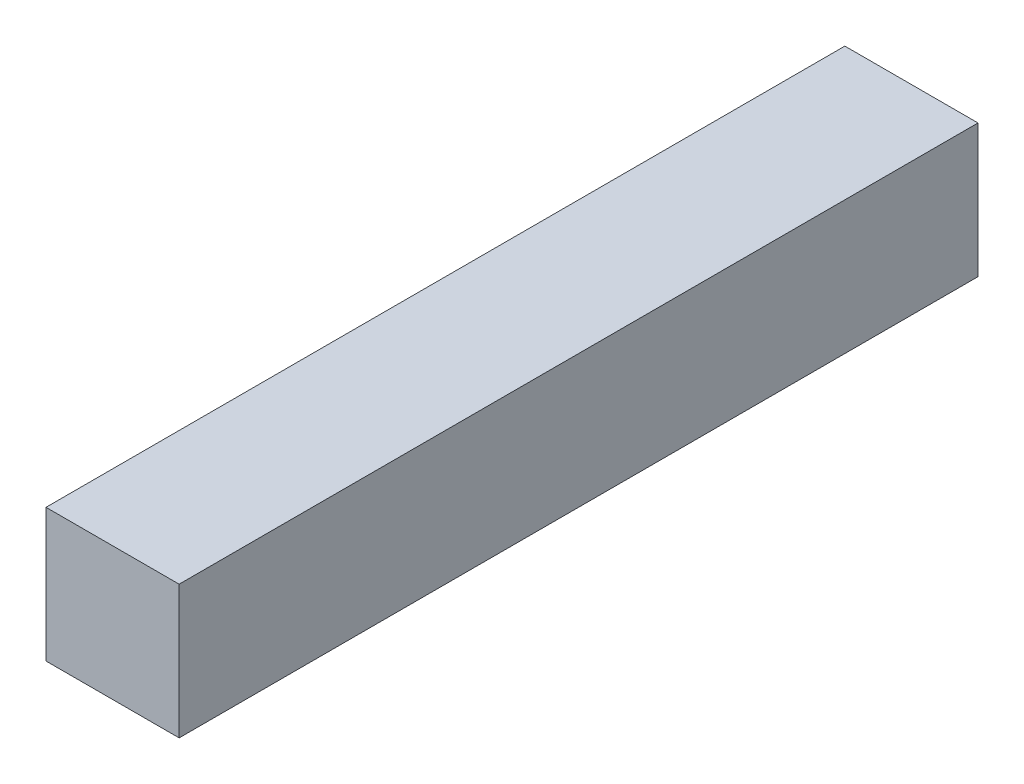
ISO-10303-21;
HEADER;
FILE_DESCRIPTION(('STEP AP214'),'2;1');
FILE_NAME('part.step','',(''),(''),'','','');
FILE_SCHEMA(('AUTOMOTIVE_DESIGN { 1 0 10303 214 1 1 1 1 }'));
ENDSEC;
DATA;
#1=APPLICATION_CONTEXT('core data for automotive mechanical design processes');
#2=APPLICATION_PROTOCOL_DEFINITION('international standard','automotive_design',2000,#1);
#3=PRODUCT_CONTEXT('',#1,'mechanical');
#4=PRODUCT('Part','Part','',(#3));
#5=PRODUCT_RELATED_PRODUCT_CATEGORY('part','',(#4));
#6=PRODUCT_DEFINITION_FORMATION('','',#4);
#7=PRODUCT_DEFINITION_CONTEXT('part definition',#1,'design');
#8=PRODUCT_DEFINITION('design','',#6,#7);
#9=PRODUCT_DEFINITION_SHAPE('','',#8);
#10=(LENGTH_UNIT() NAMED_UNIT(*) SI_UNIT(.MILLI.,.METRE.));
#11=(NAMED_UNIT(*) PLANE_ANGLE_UNIT() SI_UNIT($,.RADIAN.));
#12=(NAMED_UNIT(*) SI_UNIT($,.STERADIAN.) SOLID_ANGLE_UNIT());
#13=UNCERTAINTY_MEASURE_WITH_UNIT(LENGTH_MEASURE(1.E-05),#10,'distance_accuracy_value','');
#14=(GEOMETRIC_REPRESENTATION_CONTEXT(3) GLOBAL_UNCERTAINTY_ASSIGNED_CONTEXT((#13)) GLOBAL_UNIT_ASSIGNED_CONTEXT((#10,
#11,#12)) REPRESENTATION_CONTEXT('',''));
#15=CARTESIAN_POINT('',(0.,0.,0.));
#16=DIRECTION('',(0.,0.,1.));
#17=DIRECTION('',(1.,0.,0.));
#18=AXIS2_PLACEMENT_3D('',#15,#16,#17);
#19=CARTESIAN_POINT('',(0.,0.,0.));
#20=DIRECTION('',(0.,0.,-1.));
#21=DIRECTION('',(-1.,0.,0.));
#22=AXIS2_PLACEMENT_3D('',#19,#20,#21);
#23=PLANE('',#22);
#24=DIRECTION('',(0.,1.,0.));
#25=VECTOR('',#24,1.);
#26=CARTESIAN_POINT('',(5.,-5.,0.));
#27=LINE('',#26,#25);
#28=CARTESIAN_POINT('',(5.,-5.,0.));
#29=VERTEX_POINT('',#28);
#30=CARTESIAN_POINT('',(5.,5.,0.));
#31=VERTEX_POINT('',#30);
#32=EDGE_CURVE('E127',#29,#31,#27,.T.);
#33=ORIENTED_EDGE('',*,*,#32,.F.);
#34=DIRECTION('',(1.,0.,0.));
#35=VECTOR('',#34,1.);
#36=CARTESIAN_POINT('',(-5.,-5.,0.));
#37=LINE('',#36,#35);
#38=CARTESIAN_POINT('',(-5.,-5.,0.));
#39=VERTEX_POINT('',#38);
#40=EDGE_CURVE('E78',#39,#29,#37,.T.);
#41=ORIENTED_EDGE('',*,*,#40,.F.);
#42=DIRECTION('',(0.,-1.,0.));
#43=VECTOR('',#42,1.);
#44=CARTESIAN_POINT('',(-5.,-5.,0.));
#45=LINE('',#44,#43);
#46=CARTESIAN_POINT('',(-5.,5.,0.));
#47=VERTEX_POINT('',#46);
#48=EDGE_CURVE('E145',#47,#39,#45,.T.);
#49=ORIENTED_EDGE('',*,*,#48,.F.);
#50=DIRECTION('',(-1.,0.,0.));
#51=VECTOR('',#50,1.);
#52=CARTESIAN_POINT('',(-5.,5.,0.));
#53=LINE('',#52,#51);
#54=EDGE_CURVE('E131',#31,#47,#53,.T.);
#55=ORIENTED_EDGE('',*,*,#54,.F.);
#56=EDGE_LOOP('',(#33,#41,#49,#55));
#57=FACE_BOUND('',#56,.T.);
#58=DIRECTION('',(1.,0.,0.));
#59=VECTOR('',#58,1.);
#60=CARTESIAN_POINT('',(-1.85,-2.75,0.));
#61=LINE('',#60,#59);
#62=CARTESIAN_POINT('',(-1.85,-2.75,0.));
#63=VERTEX_POINT('',#62);
#64=CARTESIAN_POINT('',(1.85,-2.75,0.));
#65=VERTEX_POINT('',#64);
#66=EDGE_CURVE('E122',#63,#65,#61,.T.);
#67=ORIENTED_EDGE('',*,*,#66,.T.);
#68=DIRECTION('',(0.,1.,0.));
#69=VECTOR('',#68,1.);
#70=CARTESIAN_POINT('',(1.85,-2.75,0.));
#71=LINE('',#70,#69);
#72=CARTESIAN_POINT('',(1.85,2.75,0.));
#73=VERTEX_POINT('',#72);
#74=EDGE_CURVE('E48',#65,#73,#71,.T.);
#75=ORIENTED_EDGE('',*,*,#74,.T.);
#76=DIRECTION('',(-1.,0.,0.));
#77=VECTOR('',#76,1.);
#78=CARTESIAN_POINT('',(-1.85,2.75,0.));
#79=LINE('',#78,#77);
#80=CARTESIAN_POINT('',(-1.85,2.75,0.));
#81=VERTEX_POINT('',#80);
#82=EDGE_CURVE('E126',#73,#81,#79,.T.);
#83=ORIENTED_EDGE('',*,*,#82,.T.);
#84=DIRECTION('',(0.,-1.,0.));
#85=VECTOR('',#84,1.);
#86=CARTESIAN_POINT('',(-1.85,-2.75,0.));
#87=LINE('',#86,#85);
#88=EDGE_CURVE('E259',#81,#63,#87,.T.);
#89=ORIENTED_EDGE('',*,*,#88,.T.);
#90=EDGE_LOOP('',(#67,#75,#83,#89));
#91=FACE_BOUND('',#90,.T.);
#92=ADVANCED_FACE('F33',(#57,#91),#23,.T.);
#93=CARTESIAN_POINT('',(5.,-5.,60.));
#94=DIRECTION('',(-1.,0.,0.));
#95=DIRECTION('',(0.,0.,1.));
#96=AXIS2_PLACEMENT_3D('',#93,#94,#95);
#97=PLANE('',#96);
#98=ORIENTED_EDGE('',*,*,#32,.T.);
#99=DIRECTION('',(0.,0.,-1.));
#100=VECTOR('',#99,1.);
#101=CARTESIAN_POINT('',(5.,5.,60.));
#102=LINE('',#101,#100);
#103=CARTESIAN_POINT('',(5.,5.,60.));
#104=VERTEX_POINT('',#103);
#105=EDGE_CURVE('E11',#104,#31,#102,.T.);
#106=ORIENTED_EDGE('',*,*,#105,.F.);
#107=DIRECTION('',(0.,1.,0.));
#108=VECTOR('',#107,1.);
#109=CARTESIAN_POINT('',(5.,-5.,60.));
#110=LINE('',#109,#108);
#111=CARTESIAN_POINT('',(5.,-5.,60.));
#112=VERTEX_POINT('',#111);
#113=EDGE_CURVE('E137',#112,#104,#110,.T.);
#114=ORIENTED_EDGE('',*,*,#113,.F.);
#115=DIRECTION('',(0.,0.,-1.));
#116=VECTOR('',#115,1.);
#117=CARTESIAN_POINT('',(5.,-5.,60.));
#118=LINE('',#117,#116);
#119=EDGE_CURVE('E142',#112,#29,#118,.T.);
#120=ORIENTED_EDGE('',*,*,#119,.T.);
#121=EDGE_LOOP('',(#98,#106,#114,#120));
#122=FACE_BOUND('',#121,.T.);
#123=ADVANCED_FACE('F35',(#122),#97,.F.);
#124=CARTESIAN_POINT('',(-5.,5.,60.));
#125=DIRECTION('',(0.,-1.,0.));
#126=DIRECTION('',(0.,0.,-1.));
#127=AXIS2_PLACEMENT_3D('',#124,#125,#126);
#128=PLANE('',#127);
#129=ORIENTED_EDGE('',*,*,#54,.T.);
#130=DIRECTION('',(0.,0.,-1.));
#131=VECTOR('',#130,1.);
#132=CARTESIAN_POINT('',(-5.,5.,60.));
#133=LINE('',#132,#131);
#134=CARTESIAN_POINT('',(-5.,5.,60.));
#135=VERTEX_POINT('',#134);
#136=EDGE_CURVE('E41',#135,#47,#133,.T.);
#137=ORIENTED_EDGE('',*,*,#136,.F.);
#138=DIRECTION('',(-1.,0.,0.));
#139=VECTOR('',#138,1.);
#140=CARTESIAN_POINT('',(-5.,5.,60.));
#141=LINE('',#140,#139);
#142=EDGE_CURVE('E85',#104,#135,#141,.T.);
#143=ORIENTED_EDGE('',*,*,#142,.F.);
#144=ORIENTED_EDGE('',*,*,#105,.T.);
#145=EDGE_LOOP('',(#129,#137,#143,#144));
#146=FACE_BOUND('',#145,.T.);
#147=ADVANCED_FACE('F171',(#146),#128,.F.);
#148=CARTESIAN_POINT('',(-5.,-5.,60.));
#149=DIRECTION('',(1.,0.,0.));
#150=DIRECTION('',(0.,0.,-1.));
#151=AXIS2_PLACEMENT_3D('',#148,#149,#150);
#152=PLANE('',#151);
#153=ORIENTED_EDGE('',*,*,#48,.T.);
#154=DIRECTION('',(0.,0.,-1.));
#155=VECTOR('',#154,1.);
#156=CARTESIAN_POINT('',(-5.,-5.,60.));
#157=LINE('',#156,#155);
#158=CARTESIAN_POINT('',(-5.,-5.,60.));
#159=VERTEX_POINT('',#158);
#160=EDGE_CURVE('E149',#159,#39,#157,.T.);
#161=ORIENTED_EDGE('',*,*,#160,.F.);
#162=DIRECTION('',(0.,-1.,0.));
#163=VECTOR('',#162,1.);
#164=CARTESIAN_POINT('',(-5.,-5.,60.));
#165=LINE('',#164,#163);
#166=EDGE_CURVE('E140',#135,#159,#165,.T.);
#167=ORIENTED_EDGE('',*,*,#166,.F.);
#168=ORIENTED_EDGE('',*,*,#136,.T.);
#169=EDGE_LOOP('',(#153,#161,#167,#168));
#170=FACE_BOUND('',#169,.T.);
#171=ADVANCED_FACE('F154',(#170),#152,.F.);
#172=CARTESIAN_POINT('',(-5.,-5.,60.));
#173=DIRECTION('',(0.,1.,0.));
#174=DIRECTION('',(0.,0.,1.));
#175=AXIS2_PLACEMENT_3D('',#172,#173,#174);
#176=PLANE('',#175);
#177=ORIENTED_EDGE('',*,*,#40,.T.);
#178=ORIENTED_EDGE('',*,*,#119,.F.);
#179=DIRECTION('',(1.,0.,0.));
#180=VECTOR('',#179,1.);
#181=CARTESIAN_POINT('',(-5.,-5.,60.));
#182=LINE('',#181,#180);
#183=EDGE_CURVE('E57',#159,#112,#182,.T.);
#184=ORIENTED_EDGE('',*,*,#183,.F.);
#185=ORIENTED_EDGE('',*,*,#160,.T.);
#186=EDGE_LOOP('',(#177,#178,#184,#185));
#187=FACE_BOUND('',#186,.T.);
#188=ADVANCED_FACE('F162',(#187),#176,.F.);
#189=CARTESIAN_POINT('',(0.,0.,60.));
#190=DIRECTION('',(0.,0.,-1.));
#191=DIRECTION('',(-1.,0.,0.));
#192=AXIS2_PLACEMENT_3D('',#189,#190,#191);
#193=PLANE('',#192);
#194=ORIENTED_EDGE('',*,*,#113,.T.);
#195=ORIENTED_EDGE('',*,*,#142,.T.);
#196=ORIENTED_EDGE('',*,*,#166,.T.);
#197=ORIENTED_EDGE('',*,*,#183,.T.);
#198=EDGE_LOOP('',(#194,#195,#196,#197));
#199=FACE_BOUND('',#198,.T.);
#200=ADVANCED_FACE('F164',(#199),#193,.F.);
#201=CARTESIAN_POINT('',(1.85,-2.75,5.));
#202=DIRECTION('',(-1.,0.,0.));
#203=DIRECTION('',(0.,0.,1.));
#204=AXIS2_PLACEMENT_3D('',#201,#202,#203);
#205=PLANE('',#204);
#206=ORIENTED_EDGE('',*,*,#74,.F.);
#207=DIRECTION('',(0.,0.,-1.));
#208=VECTOR('',#207,1.);
#209=CARTESIAN_POINT('',(1.85,-2.75,5.));
#210=LINE('',#209,#208);
#211=CARTESIAN_POINT('',(1.85,-2.75,5.));
#212=VERTEX_POINT('',#211);
#213=EDGE_CURVE('E121',#212,#65,#210,.T.);
#214=ORIENTED_EDGE('',*,*,#213,.F.);
#215=DIRECTION('',(0.,1.,0.));
#216=VECTOR('',#215,1.);
#217=CARTESIAN_POINT('',(1.85,-2.75,5.));
#218=LINE('',#217,#216);
#219=CARTESIAN_POINT('',(1.85,2.75,5.));
#220=VERTEX_POINT('',#219);
#221=EDGE_CURVE('E113',#212,#220,#218,.T.);
#222=ORIENTED_EDGE('',*,*,#221,.T.);
#223=DIRECTION('',(0.,0.,-1.));
#224=VECTOR('',#223,1.);
#225=CARTESIAN_POINT('',(1.85,2.75,5.));
#226=LINE('',#225,#224);
#227=EDGE_CURVE('E120',#220,#73,#226,.T.);
#228=ORIENTED_EDGE('',*,*,#227,.T.);
#229=EDGE_LOOP('',(#206,#214,#222,#228));
#230=FACE_BOUND('',#229,.T.);
#231=ADVANCED_FACE('F119',(#230),#205,.T.);
#232=CARTESIAN_POINT('',(-1.85,2.75,5.));
#233=DIRECTION('',(0.,-1.,0.));
#234=DIRECTION('',(0.,0.,-1.));
#235=AXIS2_PLACEMENT_3D('',#232,#233,#234);
#236=PLANE('',#235);
#237=ORIENTED_EDGE('',*,*,#82,.F.);
#238=ORIENTED_EDGE('',*,*,#227,.F.);
#239=DIRECTION('',(-1.,0.,0.));
#240=VECTOR('',#239,1.);
#241=CARTESIAN_POINT('',(-1.85,2.75,5.));
#242=LINE('',#241,#240);
#243=CARTESIAN_POINT('',(-1.85,2.75,5.));
#244=VERTEX_POINT('',#243);
#245=EDGE_CURVE('E109',#220,#244,#242,.T.);
#246=ORIENTED_EDGE('',*,*,#245,.T.);
#247=DIRECTION('',(0.,0.,-1.));
#248=VECTOR('',#247,1.);
#249=CARTESIAN_POINT('',(-1.85,2.75,5.));
#250=LINE('',#249,#248);
#251=EDGE_CURVE('E128',#244,#81,#250,.T.);
#252=ORIENTED_EDGE('',*,*,#251,.T.);
#253=EDGE_LOOP('',(#237,#238,#246,#252));
#254=FACE_BOUND('',#253,.T.);
#255=ADVANCED_FACE('F124',(#254),#236,.T.);
#256=CARTESIAN_POINT('',(-1.85,-2.75,5.));
#257=DIRECTION('',(1.,0.,0.));
#258=DIRECTION('',(0.,0.,-1.));
#259=AXIS2_PLACEMENT_3D('',#256,#257,#258);
#260=PLANE('',#259);
#261=ORIENTED_EDGE('',*,*,#88,.F.);
#262=ORIENTED_EDGE('',*,*,#251,.F.);
#263=DIRECTION('',(0.,-1.,0.));
#264=VECTOR('',#263,1.);
#265=CARTESIAN_POINT('',(-1.85,-2.75,5.));
#266=LINE('',#265,#264);
#267=CARTESIAN_POINT('',(-1.85,-2.75,5.));
#268=VERTEX_POINT('',#267);
#269=EDGE_CURVE('E114',#244,#268,#266,.T.);
#270=ORIENTED_EDGE('',*,*,#269,.T.);
#271=DIRECTION('',(0.,0.,-1.));
#272=VECTOR('',#271,1.);
#273=CARTESIAN_POINT('',(-1.85,-2.75,5.));
#274=LINE('',#273,#272);
#275=EDGE_CURVE('E133',#268,#63,#274,.T.);
#276=ORIENTED_EDGE('',*,*,#275,.T.);
#277=EDGE_LOOP('',(#261,#262,#270,#276));
#278=FACE_BOUND('',#277,.T.);
#279=ADVANCED_FACE('F183',(#278),#260,.T.);
#280=CARTESIAN_POINT('',(-1.85,-2.75,5.));
#281=DIRECTION('',(0.,1.,0.));
#282=DIRECTION('',(0.,0.,1.));
#283=AXIS2_PLACEMENT_3D('',#280,#281,#282);
#284=PLANE('',#283);
#285=ORIENTED_EDGE('',*,*,#66,.F.);
#286=ORIENTED_EDGE('',*,*,#275,.F.);
#287=DIRECTION('',(1.,0.,0.));
#288=VECTOR('',#287,1.);
#289=CARTESIAN_POINT('',(-1.85,-2.75,5.));
#290=LINE('',#289,#288);
#291=EDGE_CURVE('E266',#268,#212,#290,.T.);
#292=ORIENTED_EDGE('',*,*,#291,.T.);
#293=ORIENTED_EDGE('',*,*,#213,.T.);
#294=EDGE_LOOP('',(#285,#286,#292,#293));
#295=FACE_BOUND('',#294,.T.);
#296=ADVANCED_FACE('F186',(#295),#284,.T.);
#297=CARTESIAN_POINT('',(0.,0.,5.));
#298=DIRECTION('',(0.,0.,-1.));
#299=DIRECTION('',(-1.,0.,0.));
#300=AXIS2_PLACEMENT_3D('',#297,#298,#299);
#301=PLANE('',#300);
#302=ORIENTED_EDGE('',*,*,#221,.F.);
#303=ORIENTED_EDGE('',*,*,#291,.F.);
#304=ORIENTED_EDGE('',*,*,#269,.F.);
#305=ORIENTED_EDGE('',*,*,#245,.F.);
#306=EDGE_LOOP('',(#302,#303,#304,#305));
#307=FACE_BOUND('',#306,.T.);
#308=ADVANCED_FACE('F111',(#307),#301,.T.);
#309=CLOSED_SHELL('',(#92,#123,#147,#171,#188,#200,#231,#255,#279,#296,#308));
#310=MANIFOLD_SOLID_BREP('B2',#309);
#311=ADVANCED_BREP_SHAPE_REPRESENTATION('',(#18,#310),#14);
#312=SHAPE_DEFINITION_REPRESENTATION(#9,#311);
ENDSEC;
END-ISO-10303-21;
